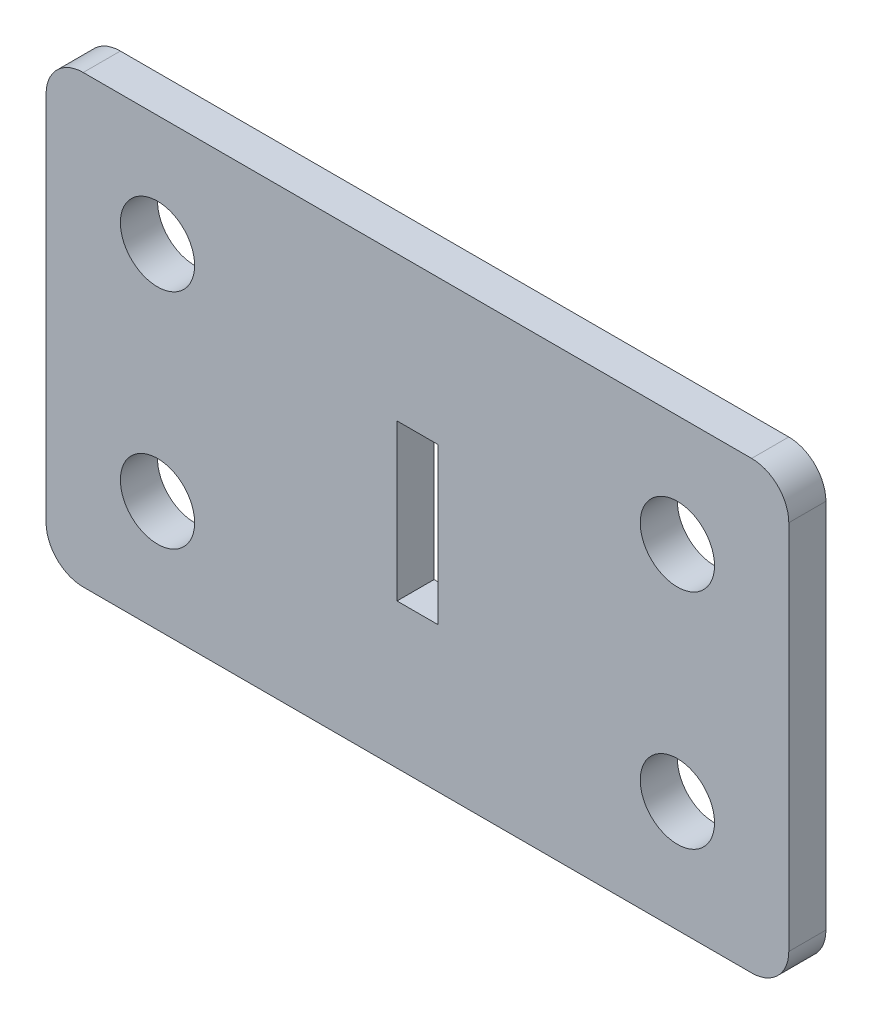
ISO-10303-21;
HEADER;
FILE_DESCRIPTION(('STEP AP214'),'2;1');
FILE_NAME('part.step','',(''),(''),'','','');
FILE_SCHEMA(('AUTOMOTIVE_DESIGN { 1 0 10303 214 1 1 1 1 }'));
ENDSEC;
DATA;
#1=APPLICATION_CONTEXT('core data for automotive mechanical design processes');
#2=APPLICATION_PROTOCOL_DEFINITION('international standard','automotive_design',2000,#1);
#3=PRODUCT_CONTEXT('',#1,'mechanical');
#4=PRODUCT('Part','Part','',(#3));
#5=PRODUCT_RELATED_PRODUCT_CATEGORY('part','',(#4));
#6=PRODUCT_DEFINITION_FORMATION('','',#4);
#7=PRODUCT_DEFINITION_CONTEXT('part definition',#1,'design');
#8=PRODUCT_DEFINITION('design','',#6,#7);
#9=PRODUCT_DEFINITION_SHAPE('','',#8);
#10=(LENGTH_UNIT() NAMED_UNIT(*) SI_UNIT(.MILLI.,.METRE.));
#11=(NAMED_UNIT(*) PLANE_ANGLE_UNIT() SI_UNIT($,.RADIAN.));
#12=(NAMED_UNIT(*) SI_UNIT($,.STERADIAN.) SOLID_ANGLE_UNIT());
#13=UNCERTAINTY_MEASURE_WITH_UNIT(LENGTH_MEASURE(1.E-05),#10,'distance_accuracy_value','');
#14=(GEOMETRIC_REPRESENTATION_CONTEXT(3) GLOBAL_UNCERTAINTY_ASSIGNED_CONTEXT((#13)) GLOBAL_UNIT_ASSIGNED_CONTEXT((#10,
#11,#12)) REPRESENTATION_CONTEXT('',''));
#15=CARTESIAN_POINT('',(0.,0.,0.));
#16=DIRECTION('',(0.,0.,1.));
#17=DIRECTION('',(1.,0.,0.));
#18=AXIS2_PLACEMENT_3D('',#15,#16,#17);
#19=CARTESIAN_POINT('',(50.,30.,-5.));
#20=DIRECTION('',(1.,0.,0.));
#21=DIRECTION('',(0.,1.,0.));
#22=AXIS2_PLACEMENT_3D('',#19,#20,#21);
#23=PLANE('',#22);
#24=DIRECTION('',(0.,1.,0.));
#25=VECTOR('',#24,1.);
#26=CARTESIAN_POINT('',(50.,30.,0.));
#27=LINE('',#26,#25);
#28=CARTESIAN_POINT('',(50.,-25.,0.));
#29=VERTEX_POINT('',#28);
#30=CARTESIAN_POINT('',(50.,25.,0.));
#31=VERTEX_POINT('',#30);
#32=EDGE_CURVE('E176',#29,#31,#27,.T.);
#33=ORIENTED_EDGE('',*,*,#32,.F.);
#34=DIRECTION('',(0.,0.,1.));
#35=VECTOR('',#34,1.);
#36=CARTESIAN_POINT('',(50.,-25.,-5.));
#37=LINE('',#36,#35);
#38=CARTESIAN_POINT('',(50.,-25.,-5.));
#39=VERTEX_POINT('',#38);
#40=EDGE_CURVE('E216',#29,#39,#37,.F.);
#41=ORIENTED_EDGE('',*,*,#40,.T.);
#42=DIRECTION('',(0.,1.,0.));
#43=VECTOR('',#42,1.);
#44=CARTESIAN_POINT('',(50.,30.,-5.));
#45=LINE('',#44,#43);
#46=CARTESIAN_POINT('',(50.,25.,-5.));
#47=VERTEX_POINT('',#46);
#48=EDGE_CURVE('E177',#39,#47,#45,.T.);
#49=ORIENTED_EDGE('',*,*,#48,.T.);
#50=DIRECTION('',(0.,0.,1.));
#51=VECTOR('',#50,1.);
#52=CARTESIAN_POINT('',(50.,25.,-5.));
#53=LINE('',#52,#51);
#54=EDGE_CURVE('E213',#47,#31,#53,.T.);
#55=ORIENTED_EDGE('',*,*,#54,.T.);
#56=EDGE_LOOP('',(#33,#41,#49,#55));
#57=FACE_BOUND('',#56,.T.);
#58=ADVANCED_FACE('F36',(#57),#23,.T.);
#59=CARTESIAN_POINT('',(-50.,-30.,-5.));
#60=DIRECTION('',(0.,-1.,0.));
#61=DIRECTION('',(0.,0.,-1.));
#62=AXIS2_PLACEMENT_3D('',#59,#60,#61);
#63=PLANE('',#62);
#64=DIRECTION('',(1.,0.,0.));
#65=VECTOR('',#64,1.);
#66=CARTESIAN_POINT('',(-50.,-30.,-5.));
#67=LINE('',#66,#65);
#68=CARTESIAN_POINT('',(-45.,-30.,-5.));
#69=VERTEX_POINT('',#68);
#70=CARTESIAN_POINT('',(45.,-30.,-5.));
#71=VERTEX_POINT('',#70);
#72=EDGE_CURVE('E187',#69,#71,#67,.T.);
#73=ORIENTED_EDGE('',*,*,#72,.T.);
#74=DIRECTION('',(0.,0.,1.));
#75=VECTOR('',#74,1.);
#76=CARTESIAN_POINT('',(45.,-30.,-5.));
#77=LINE('',#76,#75);
#78=CARTESIAN_POINT('',(45.,-30.,0.));
#79=VERTEX_POINT('',#78);
#80=EDGE_CURVE('E202',#71,#79,#77,.T.);
#81=ORIENTED_EDGE('',*,*,#80,.T.);
#82=DIRECTION('',(1.,0.,0.));
#83=VECTOR('',#82,1.);
#84=CARTESIAN_POINT('',(-50.,-30.,0.));
#85=LINE('',#84,#83);
#86=CARTESIAN_POINT('',(-45.,-30.,0.));
#87=VERTEX_POINT('',#86);
#88=EDGE_CURVE('E181',#87,#79,#85,.T.);
#89=ORIENTED_EDGE('',*,*,#88,.F.);
#90=DIRECTION('',(0.,0.,1.));
#91=VECTOR('',#90,1.);
#92=CARTESIAN_POINT('',(-45.,-30.,-5.));
#93=LINE('',#92,#91);
#94=EDGE_CURVE('E190',#87,#69,#93,.F.);
#95=ORIENTED_EDGE('',*,*,#94,.T.);
#96=EDGE_LOOP('',(#73,#81,#89,#95));
#97=FACE_BOUND('',#96,.T.);
#98=ADVANCED_FACE('F261',(#97),#63,.T.);
#99=CARTESIAN_POINT('',(-50.,30.,-5.));
#100=DIRECTION('',(-1.,0.,0.));
#101=DIRECTION('',(0.,-1.,0.));
#102=AXIS2_PLACEMENT_3D('',#99,#100,#101);
#103=PLANE('',#102);
#104=DIRECTION('',(0.,-1.,0.));
#105=VECTOR('',#104,1.);
#106=CARTESIAN_POINT('',(-50.,30.,-5.));
#107=LINE('',#106,#105);
#108=CARTESIAN_POINT('',(-50.,25.,-5.));
#109=VERTEX_POINT('',#108);
#110=CARTESIAN_POINT('',(-50.,-25.,-5.));
#111=VERTEX_POINT('',#110);
#112=EDGE_CURVE('E184',#109,#111,#107,.T.);
#113=ORIENTED_EDGE('',*,*,#112,.T.);
#114=DIRECTION('',(0.,0.,1.));
#115=VECTOR('',#114,1.);
#116=CARTESIAN_POINT('',(-50.,-25.,-5.));
#117=LINE('',#116,#115);
#118=CARTESIAN_POINT('',(-50.,-25.,0.));
#119=VERTEX_POINT('',#118);
#120=EDGE_CURVE('E228',#111,#119,#117,.T.);
#121=ORIENTED_EDGE('',*,*,#120,.T.);
#122=DIRECTION('',(0.,-1.,0.));
#123=VECTOR('',#122,1.);
#124=CARTESIAN_POINT('',(-50.,30.,0.));
#125=LINE('',#124,#123);
#126=CARTESIAN_POINT('',(-50.,25.,0.));
#127=VERTEX_POINT('',#126);
#128=EDGE_CURVE('E196',#127,#119,#125,.T.);
#129=ORIENTED_EDGE('',*,*,#128,.F.);
#130=DIRECTION('',(0.,0.,1.));
#131=VECTOR('',#130,1.);
#132=CARTESIAN_POINT('',(-50.,25.,-5.));
#133=LINE('',#132,#131);
#134=EDGE_CURVE('E226',#127,#109,#133,.F.);
#135=ORIENTED_EDGE('',*,*,#134,.T.);
#136=EDGE_LOOP('',(#113,#121,#129,#135));
#137=FACE_BOUND('',#136,.T.);
#138=ADVANCED_FACE('F267',(#137),#103,.T.);
#139=CARTESIAN_POINT('',(-50.,30.,-5.));
#140=DIRECTION('',(0.,1.,0.));
#141=DIRECTION('',(0.,0.,1.));
#142=AXIS2_PLACEMENT_3D('',#139,#140,#141);
#143=PLANE('',#142);
#144=DIRECTION('',(-1.,0.,0.));
#145=VECTOR('',#144,1.);
#146=CARTESIAN_POINT('',(-50.,30.,-5.));
#147=LINE('',#146,#145);
#148=CARTESIAN_POINT('',(45.,30.,-5.));
#149=VERTEX_POINT('',#148);
#150=CARTESIAN_POINT('',(-45.,30.,-5.));
#151=VERTEX_POINT('',#150);
#152=EDGE_CURVE('E180',#149,#151,#147,.T.);
#153=ORIENTED_EDGE('',*,*,#152,.T.);
#154=DIRECTION('',(0.,0.,1.));
#155=VECTOR('',#154,1.);
#156=CARTESIAN_POINT('',(-45.,30.,-5.));
#157=LINE('',#156,#155);
#158=CARTESIAN_POINT('',(-45.,30.,0.));
#159=VERTEX_POINT('',#158);
#160=EDGE_CURVE('E233',#151,#159,#157,.T.);
#161=ORIENTED_EDGE('',*,*,#160,.T.);
#162=DIRECTION('',(-1.,0.,0.));
#163=VECTOR('',#162,1.);
#164=CARTESIAN_POINT('',(-50.,30.,0.));
#165=LINE('',#164,#163);
#166=CARTESIAN_POINT('',(45.,30.,0.));
#167=VERTEX_POINT('',#166);
#168=EDGE_CURVE('E193',#167,#159,#165,.T.);
#169=ORIENTED_EDGE('',*,*,#168,.F.);
#170=DIRECTION('',(0.,0.,1.));
#171=VECTOR('',#170,1.);
#172=CARTESIAN_POINT('',(45.,30.,-5.));
#173=LINE('',#172,#171);
#174=EDGE_CURVE('E231',#167,#149,#173,.F.);
#175=ORIENTED_EDGE('',*,*,#174,.T.);
#176=EDGE_LOOP('',(#153,#161,#169,#175));
#177=FACE_BOUND('',#176,.T.);
#178=ADVANCED_FACE('F273',(#177),#143,.T.);
#179=CARTESIAN_POINT('',(0.,0.,-5.));
#180=DIRECTION('',(0.,0.,1.));
#181=DIRECTION('',(1.,0.,0.));
#182=AXIS2_PLACEMENT_3D('',#179,#180,#181);
#183=PLANE('',#182);
#184=DIRECTION('',(1.,0.,0.));
#185=VECTOR('',#184,1.);
#186=CARTESIAN_POINT('',(2.75,10.5,-5.));
#187=LINE('',#186,#185);
#188=CARTESIAN_POINT('',(-2.75,10.5,-5.));
#189=VERTEX_POINT('',#188);
#190=CARTESIAN_POINT('',(2.75,10.5,-5.));
#191=VERTEX_POINT('',#190);
#192=EDGE_CURVE('E136',#189,#191,#187,.T.);
#193=ORIENTED_EDGE('',*,*,#192,.F.);
#194=DIRECTION('',(0.,1.,0.));
#195=VECTOR('',#194,1.);
#196=CARTESIAN_POINT('',(-2.75,10.5,-5.));
#197=LINE('',#196,#195);
#198=CARTESIAN_POINT('',(-2.75,-10.5,-5.));
#199=VERTEX_POINT('',#198);
#200=EDGE_CURVE('E51',#199,#189,#197,.T.);
#201=ORIENTED_EDGE('',*,*,#200,.F.);
#202=DIRECTION('',(-1.,0.,0.));
#203=VECTOR('',#202,1.);
#204=CARTESIAN_POINT('',(2.75,-10.5,-5.));
#205=LINE('',#204,#203);
#206=CARTESIAN_POINT('',(2.75,-10.5,-5.));
#207=VERTEX_POINT('',#206);
#208=EDGE_CURVE('E143',#207,#199,#205,.T.);
#209=ORIENTED_EDGE('',*,*,#208,.F.);
#210=DIRECTION('',(0.,-1.,0.));
#211=VECTOR('',#210,1.);
#212=CARTESIAN_POINT('',(2.75,10.5,-5.));
#213=LINE('',#212,#211);
#214=EDGE_CURVE('E127',#191,#207,#213,.T.);
#215=ORIENTED_EDGE('',*,*,#214,.F.);
#216=EDGE_LOOP('',(#193,#201,#209,#215));
#217=FACE_BOUND('',#216,.T.);
#218=CARTESIAN_POINT('',(35.,-15.,-5.));
#219=DIRECTION('',(0.,0.,1.));
#220=DIRECTION('',(1.,0.,0.));
#221=AXIS2_PLACEMENT_3D('',#218,#219,#220);
#222=CIRCLE('',#221,5.);
#223=CARTESIAN_POINT('',(40.,-15.,-5.));
#224=VERTEX_POINT('',#223);
#225=EDGE_CURVE('E173',#224,#224,#222,.T.);
#226=ORIENTED_EDGE('',*,*,#225,.T.);
#227=EDGE_LOOP('',(#226));
#228=FACE_BOUND('',#227,.T.);
#229=CARTESIAN_POINT('',(35.,15.,-5.));
#230=DIRECTION('',(0.,0.,1.));
#231=DIRECTION('',(1.,0.,0.));
#232=AXIS2_PLACEMENT_3D('',#229,#230,#231);
#233=CIRCLE('',#232,5.);
#234=CARTESIAN_POINT('',(40.,15.,-5.));
#235=VERTEX_POINT('',#234);
#236=EDGE_CURVE('E170',#235,#235,#233,.T.);
#237=ORIENTED_EDGE('',*,*,#236,.T.);
#238=EDGE_LOOP('',(#237));
#239=FACE_BOUND('',#238,.T.);
#240=CARTESIAN_POINT('',(-35.,15.,-5.));
#241=DIRECTION('',(0.,0.,1.));
#242=DIRECTION('',(1.,0.,0.));
#243=AXIS2_PLACEMENT_3D('',#240,#241,#242);
#244=CIRCLE('',#243,5.);
#245=CARTESIAN_POINT('',(-30.,15.,-5.));
#246=VERTEX_POINT('',#245);
#247=EDGE_CURVE('E167',#246,#246,#244,.T.);
#248=ORIENTED_EDGE('',*,*,#247,.T.);
#249=EDGE_LOOP('',(#248));
#250=FACE_BOUND('',#249,.T.);
#251=CARTESIAN_POINT('',(-35.,-15.,-5.));
#252=DIRECTION('',(0.,0.,1.));
#253=DIRECTION('',(1.,0.,0.));
#254=AXIS2_PLACEMENT_3D('',#251,#252,#253);
#255=CIRCLE('',#254,5.);
#256=CARTESIAN_POINT('',(-30.,-15.,-5.));
#257=VERTEX_POINT('',#256);
#258=EDGE_CURVE('E164',#257,#257,#255,.T.);
#259=ORIENTED_EDGE('',*,*,#258,.T.);
#260=EDGE_LOOP('',(#259));
#261=FACE_BOUND('',#260,.T.);
#262=ORIENTED_EDGE('',*,*,#48,.F.);
#263=CARTESIAN_POINT('',(45.,-25.,-5.));
#264=DIRECTION('',(0.,0.,1.));
#265=DIRECTION('',(1.,0.,0.));
#266=AXIS2_PLACEMENT_3D('',#263,#264,#265);
#267=CIRCLE('',#266,5.);
#268=EDGE_CURVE('E224',#39,#71,#267,.F.);
#269=ORIENTED_EDGE('',*,*,#268,.T.);
#270=ORIENTED_EDGE('',*,*,#72,.F.);
#271=CARTESIAN_POINT('',(-45.,-25.,-5.));
#272=DIRECTION('',(0.,0.,1.));
#273=DIRECTION('',(1.,0.,0.));
#274=AXIS2_PLACEMENT_3D('',#271,#272,#273);
#275=CIRCLE('',#274,5.);
#276=EDGE_CURVE('E222',#69,#111,#275,.F.);
#277=ORIENTED_EDGE('',*,*,#276,.T.);
#278=ORIENTED_EDGE('',*,*,#112,.F.);
#279=CARTESIAN_POINT('',(-45.,25.,-5.));
#280=DIRECTION('',(0.,0.,1.));
#281=DIRECTION('',(1.,0.,0.));
#282=AXIS2_PLACEMENT_3D('',#279,#280,#281);
#283=CIRCLE('',#282,5.);
#284=EDGE_CURVE('E220',#109,#151,#283,.F.);
#285=ORIENTED_EDGE('',*,*,#284,.T.);
#286=ORIENTED_EDGE('',*,*,#152,.F.);
#287=CARTESIAN_POINT('',(45.,25.,-5.));
#288=DIRECTION('',(0.,0.,1.));
#289=DIRECTION('',(1.,0.,0.));
#290=AXIS2_PLACEMENT_3D('',#287,#288,#289);
#291=CIRCLE('',#290,5.);
#292=EDGE_CURVE('E218',#149,#47,#291,.F.);
#293=ORIENTED_EDGE('',*,*,#292,.T.);
#294=EDGE_LOOP('',(#262,#269,#270,#277,#278,#285,#286,#293));
#295=FACE_BOUND('',#294,.T.);
#296=ADVANCED_FACE('F140',(#217,#228,#239,#250,#261,#295),#183,.F.);
#297=CARTESIAN_POINT('',(0.,0.,0.));
#298=DIRECTION('',(0.,0.,1.));
#299=DIRECTION('',(1.,0.,0.));
#300=AXIS2_PLACEMENT_3D('',#297,#298,#299);
#301=PLANE('',#300);
#302=DIRECTION('',(0.,-1.,0.));
#303=VECTOR('',#302,1.);
#304=CARTESIAN_POINT('',(-2.75,0.,0.));
#305=LINE('',#304,#303);
#306=CARTESIAN_POINT('',(-2.75,10.5,0.));
#307=VERTEX_POINT('',#306);
#308=CARTESIAN_POINT('',(-2.75,-10.5,0.));
#309=VERTEX_POINT('',#308);
#310=EDGE_CURVE('E11',#307,#309,#305,.T.);
#311=ORIENTED_EDGE('',*,*,#310,.F.);
#312=DIRECTION('',(-1.,0.,0.));
#313=VECTOR('',#312,1.);
#314=CARTESIAN_POINT('',(0.,10.5,0.));
#315=LINE('',#314,#313);
#316=CARTESIAN_POINT('',(2.75,10.5,0.));
#317=VERTEX_POINT('',#316);
#318=EDGE_CURVE('E236',#317,#307,#315,.T.);
#319=ORIENTED_EDGE('',*,*,#318,.F.);
#320=DIRECTION('',(0.,1.,0.));
#321=VECTOR('',#320,1.);
#322=CARTESIAN_POINT('',(2.75,0.,0.));
#323=LINE('',#322,#321);
#324=CARTESIAN_POINT('',(2.75,-10.5,0.));
#325=VERTEX_POINT('',#324);
#326=EDGE_CURVE('E130',#325,#317,#323,.T.);
#327=ORIENTED_EDGE('',*,*,#326,.F.);
#328=DIRECTION('',(1.,0.,0.));
#329=VECTOR('',#328,1.);
#330=CARTESIAN_POINT('',(0.,-10.5,0.));
#331=LINE('',#330,#329);
#332=EDGE_CURVE('E44',#309,#325,#331,.T.);
#333=ORIENTED_EDGE('',*,*,#332,.F.);
#334=EDGE_LOOP('',(#311,#319,#327,#333));
#335=FACE_BOUND('',#334,.T.);
#336=CARTESIAN_POINT('',(35.,-15.,0.));
#337=DIRECTION('',(0.,0.,1.));
#338=DIRECTION('',(1.,0.,0.));
#339=AXIS2_PLACEMENT_3D('',#336,#337,#338);
#340=CIRCLE('',#339,5.);
#341=CARTESIAN_POINT('',(40.,-15.,0.));
#342=VERTEX_POINT('',#341);
#343=EDGE_CURVE('E150',#342,#342,#340,.T.);
#344=ORIENTED_EDGE('',*,*,#343,.F.);
#345=EDGE_LOOP('',(#344));
#346=FACE_BOUND('',#345,.T.);
#347=CARTESIAN_POINT('',(35.,15.,0.));
#348=DIRECTION('',(0.,0.,1.));
#349=DIRECTION('',(1.,0.,0.));
#350=AXIS2_PLACEMENT_3D('',#347,#348,#349);
#351=CIRCLE('',#350,5.);
#352=CARTESIAN_POINT('',(40.,15.,0.));
#353=VERTEX_POINT('',#352);
#354=EDGE_CURVE('E157',#353,#353,#351,.T.);
#355=ORIENTED_EDGE('',*,*,#354,.F.);
#356=EDGE_LOOP('',(#355));
#357=FACE_BOUND('',#356,.T.);
#358=CARTESIAN_POINT('',(-35.,15.,0.));
#359=DIRECTION('',(0.,0.,1.));
#360=DIRECTION('',(1.,0.,0.));
#361=AXIS2_PLACEMENT_3D('',#358,#359,#360);
#362=CIRCLE('',#361,5.);
#363=CARTESIAN_POINT('',(-30.,15.,0.));
#364=VERTEX_POINT('',#363);
#365=EDGE_CURVE('E153',#364,#364,#362,.T.);
#366=ORIENTED_EDGE('',*,*,#365,.F.);
#367=EDGE_LOOP('',(#366));
#368=FACE_BOUND('',#367,.T.);
#369=CARTESIAN_POINT('',(-35.,-15.,0.));
#370=DIRECTION('',(0.,0.,1.));
#371=DIRECTION('',(1.,0.,0.));
#372=AXIS2_PLACEMENT_3D('',#369,#370,#371);
#373=CIRCLE('',#372,5.);
#374=CARTESIAN_POINT('',(-30.,-15.,0.));
#375=VERTEX_POINT('',#374);
#376=EDGE_CURVE('E156',#375,#375,#373,.T.);
#377=ORIENTED_EDGE('',*,*,#376,.F.);
#378=EDGE_LOOP('',(#377));
#379=FACE_BOUND('',#378,.T.);
#380=ORIENTED_EDGE('',*,*,#88,.T.);
#381=CARTESIAN_POINT('',(45.,-25.,0.));
#382=DIRECTION('',(0.,0.,1.));
#383=DIRECTION('',(1.,0.,0.));
#384=AXIS2_PLACEMENT_3D('',#381,#382,#383);
#385=CIRCLE('',#384,5.);
#386=EDGE_CURVE('E211',#79,#29,#385,.T.);
#387=ORIENTED_EDGE('',*,*,#386,.T.);
#388=ORIENTED_EDGE('',*,*,#32,.T.);
#389=CARTESIAN_POINT('',(45.,25.,0.));
#390=DIRECTION('',(0.,0.,1.));
#391=DIRECTION('',(1.,0.,0.));
#392=AXIS2_PLACEMENT_3D('',#389,#390,#391);
#393=CIRCLE('',#392,5.);
#394=EDGE_CURVE('E205',#31,#167,#393,.T.);
#395=ORIENTED_EDGE('',*,*,#394,.T.);
#396=ORIENTED_EDGE('',*,*,#168,.T.);
#397=CARTESIAN_POINT('',(-45.,25.,0.));
#398=DIRECTION('',(0.,0.,1.));
#399=DIRECTION('',(1.,0.,0.));
#400=AXIS2_PLACEMENT_3D('',#397,#398,#399);
#401=CIRCLE('',#400,5.);
#402=EDGE_CURVE('E207',#159,#127,#401,.T.);
#403=ORIENTED_EDGE('',*,*,#402,.T.);
#404=ORIENTED_EDGE('',*,*,#128,.T.);
#405=CARTESIAN_POINT('',(-45.,-25.,0.));
#406=DIRECTION('',(0.,0.,1.));
#407=DIRECTION('',(1.,0.,0.));
#408=AXIS2_PLACEMENT_3D('',#405,#406,#407);
#409=CIRCLE('',#408,5.);
#410=EDGE_CURVE('E209',#119,#87,#409,.T.);
#411=ORIENTED_EDGE('',*,*,#410,.T.);
#412=EDGE_LOOP('',(#380,#387,#388,#395,#396,#403,#404,#411));
#413=FACE_BOUND('',#412,.T.);
#414=ADVANCED_FACE('F244',(#335,#346,#357,#368,#379,#413),#301,.T.);
#415=CARTESIAN_POINT('',(45.,-25.,-5.));
#416=DIRECTION('',(0.,0.,1.));
#417=DIRECTION('',(1.,0.,0.));
#418=AXIS2_PLACEMENT_3D('',#415,#416,#417);
#419=CYLINDRICAL_SURFACE('',#418,5.);
#420=ORIENTED_EDGE('',*,*,#268,.F.);
#421=ORIENTED_EDGE('',*,*,#40,.F.);
#422=ORIENTED_EDGE('',*,*,#386,.F.);
#423=ORIENTED_EDGE('',*,*,#80,.F.);
#424=EDGE_LOOP('',(#420,#421,#422,#423));
#425=FACE_BOUND('',#424,.T.);
#426=ADVANCED_FACE('F275',(#425),#419,.T.);
#427=CARTESIAN_POINT('',(-45.,-25.,-5.));
#428=DIRECTION('',(0.,0.,1.));
#429=DIRECTION('',(1.,0.,0.));
#430=AXIS2_PLACEMENT_3D('',#427,#428,#429);
#431=CYLINDRICAL_SURFACE('',#430,5.);
#432=ORIENTED_EDGE('',*,*,#276,.F.);
#433=ORIENTED_EDGE('',*,*,#94,.F.);
#434=ORIENTED_EDGE('',*,*,#410,.F.);
#435=ORIENTED_EDGE('',*,*,#120,.F.);
#436=EDGE_LOOP('',(#432,#433,#434,#435));
#437=FACE_BOUND('',#436,.T.);
#438=ADVANCED_FACE('F278',(#437),#431,.T.);
#439=CARTESIAN_POINT('',(-45.,25.,-5.));
#440=DIRECTION('',(0.,0.,1.));
#441=DIRECTION('',(1.,0.,0.));
#442=AXIS2_PLACEMENT_3D('',#439,#440,#441);
#443=CYLINDRICAL_SURFACE('',#442,5.);
#444=ORIENTED_EDGE('',*,*,#284,.F.);
#445=ORIENTED_EDGE('',*,*,#134,.F.);
#446=ORIENTED_EDGE('',*,*,#402,.F.);
#447=ORIENTED_EDGE('',*,*,#160,.F.);
#448=EDGE_LOOP('',(#444,#445,#446,#447));
#449=FACE_BOUND('',#448,.T.);
#450=ADVANCED_FACE('F281',(#449),#443,.T.);
#451=CARTESIAN_POINT('',(45.,25.,-5.));
#452=DIRECTION('',(0.,0.,1.));
#453=DIRECTION('',(1.,0.,0.));
#454=AXIS2_PLACEMENT_3D('',#451,#452,#453);
#455=CYLINDRICAL_SURFACE('',#454,5.);
#456=ORIENTED_EDGE('',*,*,#292,.F.);
#457=ORIENTED_EDGE('',*,*,#174,.F.);
#458=ORIENTED_EDGE('',*,*,#394,.F.);
#459=ORIENTED_EDGE('',*,*,#54,.F.);
#460=EDGE_LOOP('',(#456,#457,#458,#459));
#461=FACE_BOUND('',#460,.T.);
#462=ADVANCED_FACE('F38',(#461),#455,.T.);
#463=CARTESIAN_POINT('',(-35.,-15.,-10.));
#464=DIRECTION('',(0.,0.,1.));
#465=DIRECTION('',(1.,0.,0.));
#466=AXIS2_PLACEMENT_3D('',#463,#464,#465);
#467=CYLINDRICAL_SURFACE('',#466,5.);
#468=ORIENTED_EDGE('',*,*,#376,.T.);
#469=EDGE_LOOP('',(#468));
#470=FACE_BOUND('',#469,.T.);
#471=ORIENTED_EDGE('',*,*,#258,.F.);
#472=EDGE_LOOP('',(#471));
#473=FACE_BOUND('',#472,.T.);
#474=ADVANCED_FACE('F288',(#470,#473),#467,.F.);
#475=CARTESIAN_POINT('',(-35.,15.,-10.));
#476=DIRECTION('',(0.,0.,1.));
#477=DIRECTION('',(1.,0.,0.));
#478=AXIS2_PLACEMENT_3D('',#475,#476,#477);
#479=CYLINDRICAL_SURFACE('',#478,5.);
#480=ORIENTED_EDGE('',*,*,#365,.T.);
#481=EDGE_LOOP('',(#480));
#482=FACE_BOUND('',#481,.T.);
#483=ORIENTED_EDGE('',*,*,#247,.F.);
#484=EDGE_LOOP('',(#483));
#485=FACE_BOUND('',#484,.T.);
#486=ADVANCED_FACE('F366',(#482,#485),#479,.F.);
#487=CARTESIAN_POINT('',(35.,15.,-10.));
#488=DIRECTION('',(0.,0.,1.));
#489=DIRECTION('',(1.,0.,0.));
#490=AXIS2_PLACEMENT_3D('',#487,#488,#489);
#491=CYLINDRICAL_SURFACE('',#490,5.);
#492=ORIENTED_EDGE('',*,*,#354,.T.);
#493=EDGE_LOOP('',(#492));
#494=FACE_BOUND('',#493,.T.);
#495=ORIENTED_EDGE('',*,*,#236,.F.);
#496=EDGE_LOOP('',(#495));
#497=FACE_BOUND('',#496,.T.);
#498=ADVANCED_FACE('F255',(#494,#497),#491,.F.);
#499=CARTESIAN_POINT('',(35.,-15.,-10.));
#500=DIRECTION('',(0.,0.,1.));
#501=DIRECTION('',(1.,0.,0.));
#502=AXIS2_PLACEMENT_3D('',#499,#500,#501);
#503=CYLINDRICAL_SURFACE('',#502,5.);
#504=ORIENTED_EDGE('',*,*,#343,.T.);
#505=EDGE_LOOP('',(#504));
#506=FACE_BOUND('',#505,.T.);
#507=ORIENTED_EDGE('',*,*,#225,.F.);
#508=EDGE_LOOP('',(#507));
#509=FACE_BOUND('',#508,.T.);
#510=ADVANCED_FACE('F248',(#506,#509),#503,.F.);
#511=CARTESIAN_POINT('',(-2.75,10.5,5.));
#512=DIRECTION('',(-1.,0.,0.));
#513=DIRECTION('',(0.,-1.,0.));
#514=AXIS2_PLACEMENT_3D('',#511,#512,#513);
#515=PLANE('',#514);
#516=ORIENTED_EDGE('',*,*,#310,.T.);
#517=DIRECTION('',(0.,0.,-1.));
#518=VECTOR('',#517,1.);
#519=CARTESIAN_POINT('',(-2.75,-10.5,5.));
#520=LINE('',#519,#518);
#521=EDGE_CURVE('E148',#309,#199,#520,.T.);
#522=ORIENTED_EDGE('',*,*,#521,.T.);
#523=ORIENTED_EDGE('',*,*,#200,.T.);
#524=DIRECTION('',(0.,0.,-1.));
#525=VECTOR('',#524,1.);
#526=CARTESIAN_POINT('',(-2.75,10.5,5.));
#527=LINE('',#526,#525);
#528=EDGE_CURVE('E133',#307,#189,#527,.T.);
#529=ORIENTED_EDGE('',*,*,#528,.F.);
#530=EDGE_LOOP('',(#516,#522,#523,#529));
#531=FACE_BOUND('',#530,.T.);
#532=ADVANCED_FACE('F246',(#531),#515,.F.);
#533=CARTESIAN_POINT('',(2.75,-10.5,5.));
#534=DIRECTION('',(0.,-1.,0.));
#535=DIRECTION('',(0.,0.,-1.));
#536=AXIS2_PLACEMENT_3D('',#533,#534,#535);
#537=PLANE('',#536);
#538=ORIENTED_EDGE('',*,*,#332,.T.);
#539=DIRECTION('',(0.,0.,-1.));
#540=VECTOR('',#539,1.);
#541=CARTESIAN_POINT('',(2.75,-10.5,5.));
#542=LINE('',#541,#540);
#543=EDGE_CURVE('E132',#325,#207,#542,.T.);
#544=ORIENTED_EDGE('',*,*,#543,.T.);
#545=ORIENTED_EDGE('',*,*,#208,.T.);
#546=ORIENTED_EDGE('',*,*,#521,.F.);
#547=EDGE_LOOP('',(#538,#544,#545,#546));
#548=FACE_BOUND('',#547,.T.);
#549=ADVANCED_FACE('F241',(#548),#537,.F.);
#550=CARTESIAN_POINT('',(2.75,10.5,5.));
#551=DIRECTION('',(1.,0.,0.));
#552=DIRECTION('',(0.,1.,0.));
#553=AXIS2_PLACEMENT_3D('',#550,#551,#552);
#554=PLANE('',#553);
#555=ORIENTED_EDGE('',*,*,#326,.T.);
#556=DIRECTION('',(0.,0.,-1.));
#557=VECTOR('',#556,1.);
#558=CARTESIAN_POINT('',(2.75,10.5,5.));
#559=LINE('',#558,#557);
#560=EDGE_CURVE('E59',#317,#191,#559,.T.);
#561=ORIENTED_EDGE('',*,*,#560,.T.);
#562=ORIENTED_EDGE('',*,*,#214,.T.);
#563=ORIENTED_EDGE('',*,*,#543,.F.);
#564=EDGE_LOOP('',(#555,#561,#562,#563));
#565=FACE_BOUND('',#564,.T.);
#566=ADVANCED_FACE('F124',(#565),#554,.F.);
#567=CARTESIAN_POINT('',(2.75,10.5,5.));
#568=DIRECTION('',(0.,1.,0.));
#569=DIRECTION('',(0.,0.,1.));
#570=AXIS2_PLACEMENT_3D('',#567,#568,#569);
#571=PLANE('',#570);
#572=ORIENTED_EDGE('',*,*,#318,.T.);
#573=ORIENTED_EDGE('',*,*,#528,.T.);
#574=ORIENTED_EDGE('',*,*,#192,.T.);
#575=ORIENTED_EDGE('',*,*,#560,.F.);
#576=EDGE_LOOP('',(#572,#573,#574,#575));
#577=FACE_BOUND('',#576,.T.);
#578=ADVANCED_FACE('F137',(#577),#571,.F.);
#579=CLOSED_SHELL('',(#58,#98,#138,#178,#296,#414,#426,#438,#450,#462,#474,#486,#498,#510,#532,
#549,#566,#578));
#580=MANIFOLD_SOLID_BREP('B2',#579);
#581=ADVANCED_BREP_SHAPE_REPRESENTATION('',(#18,#580),#14);
#582=SHAPE_DEFINITION_REPRESENTATION(#9,#581);
ENDSEC;
END-ISO-10303-21;
